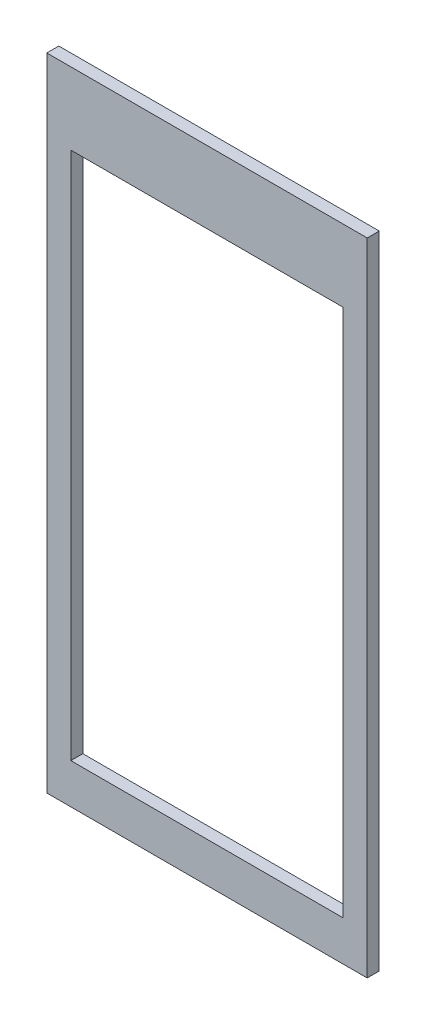
ISO-10303-21;
HEADER;
FILE_DESCRIPTION(('STEP AP214'),'2;1');
FILE_NAME('part.step','',(''),(''),'','','');
FILE_SCHEMA(('AUTOMOTIVE_DESIGN { 1 0 10303 214 1 1 1 1 }'));
ENDSEC;
DATA;
#1=APPLICATION_CONTEXT('core data for automotive mechanical design processes');
#2=APPLICATION_PROTOCOL_DEFINITION('international standard','automotive_design',2000,#1);
#3=PRODUCT_CONTEXT('',#1,'mechanical');
#4=PRODUCT('Part','Part','',(#3));
#5=PRODUCT_RELATED_PRODUCT_CATEGORY('part','',(#4));
#6=PRODUCT_DEFINITION_FORMATION('','',#4);
#7=PRODUCT_DEFINITION_CONTEXT('part definition',#1,'design');
#8=PRODUCT_DEFINITION('design','',#6,#7);
#9=PRODUCT_DEFINITION_SHAPE('','',#8);
#10=(LENGTH_UNIT() NAMED_UNIT(*) SI_UNIT(.MILLI.,.METRE.));
#11=(NAMED_UNIT(*) PLANE_ANGLE_UNIT() SI_UNIT($,.RADIAN.));
#12=(NAMED_UNIT(*) SI_UNIT($,.STERADIAN.) SOLID_ANGLE_UNIT());
#13=UNCERTAINTY_MEASURE_WITH_UNIT(LENGTH_MEASURE(1.E-05),#10,'distance_accuracy_value','');
#14=(GEOMETRIC_REPRESENTATION_CONTEXT(3) GLOBAL_UNCERTAINTY_ASSIGNED_CONTEXT((#13)) GLOBAL_UNIT_ASSIGNED_CONTEXT((#10,
#11,#12)) REPRESENTATION_CONTEXT('',''));
#15=CARTESIAN_POINT('',(0.,0.,0.));
#16=DIRECTION('',(0.,0.,1.));
#17=DIRECTION('',(1.,0.,0.));
#18=AXIS2_PLACEMENT_3D('',#15,#16,#17);
#19=CARTESIAN_POINT('',(0.,0.,1.5));
#20=DIRECTION('',(0.,0.,1.));
#21=DIRECTION('',(1.,0.,0.));
#22=AXIS2_PLACEMENT_3D('',#19,#20,#21);
#23=PLANE('',#22);
#24=DIRECTION('',(1.,0.,0.));
#25=VECTOR('',#24,1.);
#26=CARTESIAN_POINT('',(0.,0.,1.5));
#27=LINE('',#26,#25);
#28=CARTESIAN_POINT('',(0.,0.,1.5));
#29=VERTEX_POINT('',#28);
#30=CARTESIAN_POINT('',(40.,0.,1.5));
#31=VERTEX_POINT('',#30);
#32=EDGE_CURVE('E141',#29,#31,#27,.T.);
#33=ORIENTED_EDGE('',*,*,#32,.T.);
#34=DIRECTION('',(0.,1.,0.));
#35=VECTOR('',#34,1.);
#36=CARTESIAN_POINT('',(40.,0.,1.5));
#37=LINE('',#36,#35);
#38=CARTESIAN_POINT('',(40.,80.,1.5));
#39=VERTEX_POINT('',#38);
#40=EDGE_CURVE('E145',#31,#39,#37,.T.);
#41=ORIENTED_EDGE('',*,*,#40,.T.);
#42=DIRECTION('',(1.,0.,0.));
#43=VECTOR('',#42,1.);
#44=CARTESIAN_POINT('',(0.,80.,1.5));
#45=LINE('',#44,#43);
#46=CARTESIAN_POINT('',(0.,80.,1.5));
#47=VERTEX_POINT('',#46);
#48=EDGE_CURVE('E149',#47,#39,#45,.T.);
#49=ORIENTED_EDGE('',*,*,#48,.F.);
#50=DIRECTION('',(0.,1.,0.));
#51=VECTOR('',#50,1.);
#52=CARTESIAN_POINT('',(0.,0.,1.5));
#53=LINE('',#52,#51);
#54=EDGE_CURVE('E153',#29,#47,#53,.T.);
#55=ORIENTED_EDGE('',*,*,#54,.F.);
#56=EDGE_LOOP('',(#33,#41,#49,#55));
#57=FACE_BOUND('',#56,.T.);
#58=DIRECTION('',(0.,-1.,0.));
#59=VECTOR('',#58,1.);
#60=CARTESIAN_POINT('',(3.00000000000001,0.,1.5));
#61=LINE('',#60,#59);
#62=CARTESIAN_POINT('',(3.,71.,1.5));
#63=VERTEX_POINT('',#62);
#64=CARTESIAN_POINT('',(3.00000000000001,5.,1.5));
#65=VERTEX_POINT('',#64);
#66=EDGE_CURVE('E122',#63,#65,#61,.T.);
#67=ORIENTED_EDGE('',*,*,#66,.F.);
#68=DIRECTION('',(1.,0.,0.));
#69=VECTOR('',#68,1.);
#70=CARTESIAN_POINT('',(0.,71.,1.5));
#71=LINE('',#70,#69);
#72=CARTESIAN_POINT('',(37.,71.,1.5));
#73=VERTEX_POINT('',#72);
#74=EDGE_CURVE('E106',#63,#73,#71,.T.);
#75=ORIENTED_EDGE('',*,*,#74,.T.);
#76=DIRECTION('',(0.,-1.,0.));
#77=VECTOR('',#76,1.);
#78=CARTESIAN_POINT('',(37.,0.,1.5));
#79=LINE('',#78,#77);
#80=CARTESIAN_POINT('',(37.,5.,1.5));
#81=VERTEX_POINT('',#80);
#82=EDGE_CURVE('E115',#73,#81,#79,.T.);
#83=ORIENTED_EDGE('',*,*,#82,.T.);
#84=DIRECTION('',(-1.,0.,0.));
#85=VECTOR('',#84,1.);
#86=CARTESIAN_POINT('',(0.,5.,1.5));
#87=LINE('',#86,#85);
#88=EDGE_CURVE('E53',#81,#65,#87,.T.);
#89=ORIENTED_EDGE('',*,*,#88,.T.);
#90=EDGE_LOOP('',(#67,#75,#83,#89));
#91=FACE_BOUND('',#90,.T.);
#92=ADVANCED_FACE('F37',(#57,#91),#23,.T.);
#93=CARTESIAN_POINT('',(0.,0.,0.));
#94=DIRECTION('',(0.,0.,1.));
#95=DIRECTION('',(1.,0.,0.));
#96=AXIS2_PLACEMENT_3D('',#93,#94,#95);
#97=PLANE('',#96);
#98=DIRECTION('',(1.,0.,0.));
#99=VECTOR('',#98,1.);
#100=CARTESIAN_POINT('',(0.,0.,0.));
#101=LINE('',#100,#99);
#102=CARTESIAN_POINT('',(0.,0.,0.));
#103=VERTEX_POINT('',#102);
#104=CARTESIAN_POINT('',(40.,0.,0.));
#105=VERTEX_POINT('',#104);
#106=EDGE_CURVE('E158',#103,#105,#101,.T.);
#107=ORIENTED_EDGE('',*,*,#106,.F.);
#108=DIRECTION('',(0.,1.,0.));
#109=VECTOR('',#108,1.);
#110=CARTESIAN_POINT('',(0.,0.,0.));
#111=LINE('',#110,#109);
#112=CARTESIAN_POINT('',(0.,80.,0.));
#113=VERTEX_POINT('',#112);
#114=EDGE_CURVE('E146',#103,#113,#111,.T.);
#115=ORIENTED_EDGE('',*,*,#114,.T.);
#116=DIRECTION('',(1.,0.,0.));
#117=VECTOR('',#116,1.);
#118=CARTESIAN_POINT('',(0.,80.,0.));
#119=LINE('',#118,#117);
#120=CARTESIAN_POINT('',(40.,80.,0.));
#121=VERTEX_POINT('',#120);
#122=EDGE_CURVE('E167',#113,#121,#119,.T.);
#123=ORIENTED_EDGE('',*,*,#122,.T.);
#124=DIRECTION('',(0.,1.,0.));
#125=VECTOR('',#124,1.);
#126=CARTESIAN_POINT('',(40.,0.,0.));
#127=LINE('',#126,#125);
#128=EDGE_CURVE('E162',#105,#121,#127,.T.);
#129=ORIENTED_EDGE('',*,*,#128,.F.);
#130=EDGE_LOOP('',(#107,#115,#123,#129));
#131=FACE_BOUND('',#130,.T.);
#132=DIRECTION('',(-1.,0.,0.));
#133=VECTOR('',#132,1.);
#134=CARTESIAN_POINT('',(0.,71.,0.));
#135=LINE('',#134,#133);
#136=CARTESIAN_POINT('',(37.,71.,0.));
#137=VERTEX_POINT('',#136);
#138=CARTESIAN_POINT('',(3.,71.,0.));
#139=VERTEX_POINT('',#138);
#140=EDGE_CURVE('E109',#137,#139,#135,.T.);
#141=ORIENTED_EDGE('',*,*,#140,.T.);
#142=DIRECTION('',(0.,1.,0.));
#143=VECTOR('',#142,1.);
#144=CARTESIAN_POINT('',(3.00000000000001,0.,0.));
#145=LINE('',#144,#143);
#146=CARTESIAN_POINT('',(3.00000000000001,5.,0.));
#147=VERTEX_POINT('',#146);
#148=EDGE_CURVE('E140',#147,#139,#145,.T.);
#149=ORIENTED_EDGE('',*,*,#148,.F.);
#150=DIRECTION('',(1.,0.,0.));
#151=VECTOR('',#150,1.);
#152=CARTESIAN_POINT('',(0.,5.,0.));
#153=LINE('',#152,#151);
#154=CARTESIAN_POINT('',(37.,5.,0.));
#155=VERTEX_POINT('',#154);
#156=EDGE_CURVE('E284',#147,#155,#153,.T.);
#157=ORIENTED_EDGE('',*,*,#156,.T.);
#158=DIRECTION('',(0.,1.,0.));
#159=VECTOR('',#158,1.);
#160=CARTESIAN_POINT('',(37.,0.,0.));
#161=LINE('',#160,#159);
#162=EDGE_CURVE('E163',#155,#137,#161,.T.);
#163=ORIENTED_EDGE('',*,*,#162,.T.);
#164=EDGE_LOOP('',(#141,#149,#157,#163));
#165=FACE_BOUND('',#164,.T.);
#166=ADVANCED_FACE('F189',(#131,#165),#97,.F.);
#167=CARTESIAN_POINT('',(0.,0.,1.5));
#168=DIRECTION('',(0.,1.,0.));
#169=DIRECTION('',(0.,0.,1.));
#170=AXIS2_PLACEMENT_3D('',#167,#168,#169);
#171=PLANE('',#170);
#172=ORIENTED_EDGE('',*,*,#106,.T.);
#173=DIRECTION('',(0.,0.,-1.));
#174=VECTOR('',#173,1.);
#175=CARTESIAN_POINT('',(40.,0.,1.5));
#176=LINE('',#175,#174);
#177=EDGE_CURVE('E11',#31,#105,#176,.T.);
#178=ORIENTED_EDGE('',*,*,#177,.F.);
#179=ORIENTED_EDGE('',*,*,#32,.F.);
#180=DIRECTION('',(0.,0.,-1.));
#181=VECTOR('',#180,1.);
#182=CARTESIAN_POINT('',(0.,0.,1.5));
#183=LINE('',#182,#181);
#184=EDGE_CURVE('E157',#29,#103,#183,.T.);
#185=ORIENTED_EDGE('',*,*,#184,.T.);
#186=EDGE_LOOP('',(#172,#178,#179,#185));
#187=FACE_BOUND('',#186,.T.);
#188=ADVANCED_FACE('F39',(#187),#171,.F.);
#189=CARTESIAN_POINT('',(40.,0.,1.5));
#190=DIRECTION('',(-1.,0.,0.));
#191=DIRECTION('',(0.,0.,1.));
#192=AXIS2_PLACEMENT_3D('',#189,#190,#191);
#193=PLANE('',#192);
#194=ORIENTED_EDGE('',*,*,#128,.T.);
#195=DIRECTION('',(0.,0.,-1.));
#196=VECTOR('',#195,1.);
#197=CARTESIAN_POINT('',(40.,80.,1.5));
#198=LINE('',#197,#196);
#199=EDGE_CURVE('E46',#39,#121,#198,.T.);
#200=ORIENTED_EDGE('',*,*,#199,.F.);
#201=ORIENTED_EDGE('',*,*,#40,.F.);
#202=ORIENTED_EDGE('',*,*,#177,.T.);
#203=EDGE_LOOP('',(#194,#200,#201,#202));
#204=FACE_BOUND('',#203,.T.);
#205=ADVANCED_FACE('F185',(#204),#193,.F.);
#206=CARTESIAN_POINT('',(0.,80.,1.5));
#207=DIRECTION('',(0.,1.,0.));
#208=DIRECTION('',(0.,0.,1.));
#209=AXIS2_PLACEMENT_3D('',#206,#207,#208);
#210=PLANE('',#209);
#211=ORIENTED_EDGE('',*,*,#122,.F.);
#212=DIRECTION('',(0.,0.,-1.));
#213=VECTOR('',#212,1.);
#214=CARTESIAN_POINT('',(0.,80.,1.5));
#215=LINE('',#214,#213);
#216=EDGE_CURVE('E176',#47,#113,#215,.T.);
#217=ORIENTED_EDGE('',*,*,#216,.F.);
#218=ORIENTED_EDGE('',*,*,#48,.T.);
#219=ORIENTED_EDGE('',*,*,#199,.T.);
#220=EDGE_LOOP('',(#211,#217,#218,#219));
#221=FACE_BOUND('',#220,.T.);
#222=ADVANCED_FACE('F182',(#221),#210,.T.);
#223=CARTESIAN_POINT('',(0.,0.,1.5));
#224=DIRECTION('',(-1.,0.,0.));
#225=DIRECTION('',(0.,0.,1.));
#226=AXIS2_PLACEMENT_3D('',#223,#224,#225);
#227=PLANE('',#226);
#228=ORIENTED_EDGE('',*,*,#114,.F.);
#229=ORIENTED_EDGE('',*,*,#184,.F.);
#230=ORIENTED_EDGE('',*,*,#54,.T.);
#231=ORIENTED_EDGE('',*,*,#216,.T.);
#232=EDGE_LOOP('',(#228,#229,#230,#231));
#233=FACE_BOUND('',#232,.T.);
#234=ADVANCED_FACE('F193',(#233),#227,.T.);
#235=CARTESIAN_POINT('',(0.,71.,-74.2428447730824));
#236=DIRECTION('',(0.,-1.,0.));
#237=DIRECTION('',(0.,0.,-1.));
#238=AXIS2_PLACEMENT_3D('',#235,#236,#237);
#239=PLANE('',#238);
#240=DIRECTION('',(0.,0.,1.));
#241=VECTOR('',#240,1.);
#242=CARTESIAN_POINT('',(37.,71.,-74.2428447730824));
#243=LINE('',#242,#241);
#244=EDGE_CURVE('E61',#137,#73,#243,.T.);
#245=ORIENTED_EDGE('',*,*,#244,.T.);
#246=ORIENTED_EDGE('',*,*,#74,.F.);
#247=DIRECTION('',(0.,0.,1.));
#248=VECTOR('',#247,1.);
#249=CARTESIAN_POINT('',(3.,71.,-74.2428447730824));
#250=LINE('',#249,#248);
#251=EDGE_CURVE('E112',#139,#63,#250,.T.);
#252=ORIENTED_EDGE('',*,*,#251,.F.);
#253=ORIENTED_EDGE('',*,*,#140,.F.);
#254=EDGE_LOOP('',(#245,#246,#252,#253));
#255=FACE_BOUND('',#254,.T.);
#256=ADVANCED_FACE('F103',(#255),#239,.T.);
#257=CARTESIAN_POINT('',(3.00000000000001,0.,-74.2428447730824));
#258=DIRECTION('',(-1.,0.,0.));
#259=DIRECTION('',(0.,-1.,0.));
#260=AXIS2_PLACEMENT_3D('',#257,#258,#259);
#261=PLANE('',#260);
#262=ORIENTED_EDGE('',*,*,#148,.T.);
#263=ORIENTED_EDGE('',*,*,#251,.T.);
#264=ORIENTED_EDGE('',*,*,#66,.T.);
#265=DIRECTION('',(0.,0.,1.));
#266=VECTOR('',#265,1.);
#267=CARTESIAN_POINT('',(3.00000000000001,5.,-74.2428447730824));
#268=LINE('',#267,#266);
#269=EDGE_CURVE('E133',#147,#65,#268,.T.);
#270=ORIENTED_EDGE('',*,*,#269,.F.);
#271=EDGE_LOOP('',(#262,#263,#264,#270));
#272=FACE_BOUND('',#271,.T.);
#273=ADVANCED_FACE('F228',(#272),#261,.F.);
#274=CARTESIAN_POINT('',(0.,5.,-74.2428447730824));
#275=DIRECTION('',(0.,1.,0.));
#276=DIRECTION('',(-1.,0.,0.));
#277=AXIS2_PLACEMENT_3D('',#274,#275,#276);
#278=PLANE('',#277);
#279=ORIENTED_EDGE('',*,*,#269,.T.);
#280=ORIENTED_EDGE('',*,*,#88,.F.);
#281=DIRECTION('',(0.,0.,1.));
#282=VECTOR('',#281,1.);
#283=CARTESIAN_POINT('',(37.,5.,-74.2428447730824));
#284=LINE('',#283,#282);
#285=EDGE_CURVE('E117',#155,#81,#284,.T.);
#286=ORIENTED_EDGE('',*,*,#285,.F.);
#287=ORIENTED_EDGE('',*,*,#156,.F.);
#288=EDGE_LOOP('',(#279,#280,#286,#287));
#289=FACE_BOUND('',#288,.T.);
#290=ADVANCED_FACE('F235',(#289),#278,.T.);
#291=CARTESIAN_POINT('',(37.,0.,-74.2428447730824));
#292=DIRECTION('',(-1.,0.,0.));
#293=DIRECTION('',(0.,-1.,0.));
#294=AXIS2_PLACEMENT_3D('',#291,#292,#293);
#295=PLANE('',#294);
#296=ORIENTED_EDGE('',*,*,#285,.T.);
#297=ORIENTED_EDGE('',*,*,#82,.F.);
#298=ORIENTED_EDGE('',*,*,#244,.F.);
#299=ORIENTED_EDGE('',*,*,#162,.F.);
#300=EDGE_LOOP('',(#296,#297,#298,#299));
#301=FACE_BOUND('',#300,.T.);
#302=ADVANCED_FACE('F116',(#301),#295,.T.);
#303=CLOSED_SHELL('',(#92,#166,#188,#205,#222,#234,#256,#273,#290,#302));
#304=MANIFOLD_SOLID_BREP('B2',#303);
#305=ADVANCED_BREP_SHAPE_REPRESENTATION('',(#18,#304),#14);
#306=SHAPE_DEFINITION_REPRESENTATION(#9,#305);
ENDSEC;
END-ISO-10303-21;
